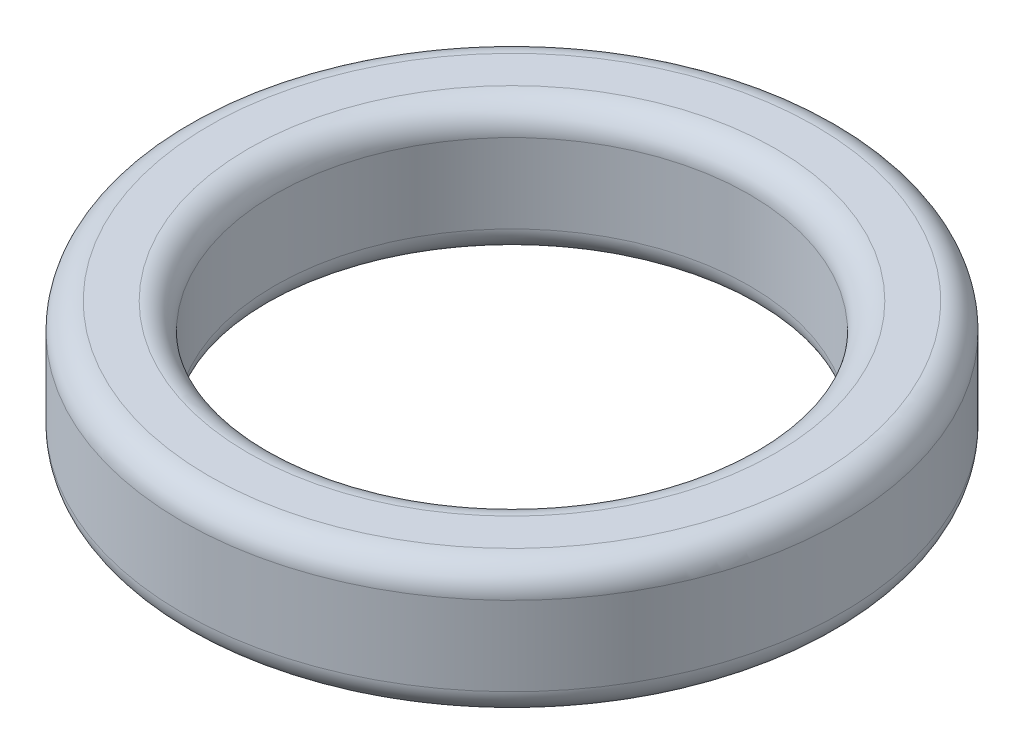
ISO-10303-21;
HEADER;
FILE_DESCRIPTION(('STEP AP214'),'2;1');
FILE_NAME('part.step','',(''),(''),'','','');
FILE_SCHEMA(('AUTOMOTIVE_DESIGN { 1 0 10303 214 1 1 1 1 }'));
ENDSEC;
DATA;
#1=APPLICATION_CONTEXT('core data for automotive mechanical design processes');
#2=APPLICATION_PROTOCOL_DEFINITION('international standard','automotive_design',2000,#1);
#3=PRODUCT_CONTEXT('',#1,'mechanical');
#4=PRODUCT('Part','Part','',(#3));
#5=PRODUCT_RELATED_PRODUCT_CATEGORY('part','',(#4));
#6=PRODUCT_DEFINITION_FORMATION('','',#4);
#7=PRODUCT_DEFINITION_CONTEXT('part definition',#1,'design');
#8=PRODUCT_DEFINITION('design','',#6,#7);
#9=PRODUCT_DEFINITION_SHAPE('','',#8);
#10=(LENGTH_UNIT() NAMED_UNIT(*) SI_UNIT(.MILLI.,.METRE.));
#11=(NAMED_UNIT(*) PLANE_ANGLE_UNIT() SI_UNIT($,.RADIAN.));
#12=(NAMED_UNIT(*) SI_UNIT($,.STERADIAN.) SOLID_ANGLE_UNIT());
#13=UNCERTAINTY_MEASURE_WITH_UNIT(LENGTH_MEASURE(1.E-05),#10,'distance_accuracy_value','');
#14=(GEOMETRIC_REPRESENTATION_CONTEXT(3) GLOBAL_UNCERTAINTY_ASSIGNED_CONTEXT((#13)) GLOBAL_UNIT_ASSIGNED_CONTEXT((#10,
#11,#12)) REPRESENTATION_CONTEXT('',''));
#15=CARTESIAN_POINT('',(0.,0.,0.));
#16=DIRECTION('',(0.,0.,1.));
#17=DIRECTION('',(1.,0.,0.));
#18=AXIS2_PLACEMENT_3D('',#15,#16,#17);
#19=CARTESIAN_POINT('',(0.,1.27,0.));
#20=DIRECTION('',(0.,1.,0.));
#21=DIRECTION('',(0.,0.,1.));
#22=AXIS2_PLACEMENT_3D('',#19,#20,#21);
#23=PLANE('',#22);
#24=CARTESIAN_POINT('',(0.,1.27,0.));
#25=DIRECTION('',(0.,1.,0.));
#26=DIRECTION('',(0.,0.,1.));
#27=AXIS2_PLACEMENT_3D('',#24,#25,#26);
#28=CIRCLE('',#27,2.54);
#29=CARTESIAN_POINT('',(0.,1.27,2.54));
#30=VERTEX_POINT('',#29);
#31=EDGE_CURVE('E10',#30,#30,#28,.F.);
#32=ORIENTED_EDGE('',*,*,#31,.T.);
#33=EDGE_LOOP('',(#32));
#34=FACE_BOUND('',#33,.T.);
#35=CARTESIAN_POINT('',(0.,1.27,0.));
#36=DIRECTION('',(0.,1.,0.));
#37=DIRECTION('',(0.,0.,1.));
#38=AXIS2_PLACEMENT_3D('',#35,#36,#37);
#39=CIRCLE('',#38,2.921);
#40=CARTESIAN_POINT('',(0.,1.27,2.921));
#41=VERTEX_POINT('',#40);
#42=EDGE_CURVE('E42',#41,#41,#39,.T.);
#43=ORIENTED_EDGE('',*,*,#42,.T.);
#44=EDGE_LOOP('',(#43));
#45=FACE_BOUND('',#44,.T.);
#46=ADVANCED_FACE('F35',(#34,#45),#23,.T.);
#47=CARTESIAN_POINT('',(0.,0.,0.));
#48=DIRECTION('',(0.,1.,0.));
#49=DIRECTION('',(0.,0.,1.));
#50=AXIS2_PLACEMENT_3D('',#47,#48,#49);
#51=PLANE('',#50);
#52=CARTESIAN_POINT('',(0.,0.,0.));
#53=DIRECTION('',(0.,1.,0.));
#54=DIRECTION('',(0.,0.,1.));
#55=AXIS2_PLACEMENT_3D('',#52,#53,#54);
#56=CIRCLE('',#55,2.54);
#57=CARTESIAN_POINT('',(0.,0.,2.54));
#58=VERTEX_POINT('',#57);
#59=EDGE_CURVE('E61',#58,#58,#56,.T.);
#60=ORIENTED_EDGE('',*,*,#59,.T.);
#61=EDGE_LOOP('',(#60));
#62=FACE_BOUND('',#61,.T.);
#63=CARTESIAN_POINT('',(0.,0.,0.));
#64=DIRECTION('',(0.,1.,0.));
#65=DIRECTION('',(0.,0.,1.));
#66=AXIS2_PLACEMENT_3D('',#63,#64,#65);
#67=CIRCLE('',#66,2.921);
#68=CARTESIAN_POINT('',(0.,0.,2.921));
#69=VERTEX_POINT('',#68);
#70=EDGE_CURVE('E64',#69,#69,#67,.F.);
#71=ORIENTED_EDGE('',*,*,#70,.T.);
#72=EDGE_LOOP('',(#71));
#73=FACE_BOUND('',#72,.T.);
#74=ADVANCED_FACE('F68',(#62,#73),#51,.F.);
#75=CARTESIAN_POINT('',(0.,1.27,0.));
#76=DIRECTION('',(0.,-1.,0.));
#77=DIRECTION('',(0.,0.,-1.));
#78=AXIS2_PLACEMENT_3D('',#75,#76,#77);
#79=CYLINDRICAL_SURFACE('',#78,3.175);
#80=CARTESIAN_POINT('',(0.,0.254,0.));
#81=DIRECTION('',(0.,1.,0.));
#82=DIRECTION('',(0.,0.,1.));
#83=AXIS2_PLACEMENT_3D('',#80,#81,#82);
#84=CIRCLE('',#83,3.175);
#85=CARTESIAN_POINT('',(0.,0.254,3.175));
#86=VERTEX_POINT('',#85);
#87=EDGE_CURVE('E46',#86,#86,#84,.T.);
#88=ORIENTED_EDGE('',*,*,#87,.T.);
#89=EDGE_LOOP('',(#88));
#90=FACE_BOUND('',#89,.T.);
#91=CARTESIAN_POINT('',(0.,1.016,0.));
#92=DIRECTION('',(0.,1.,0.));
#93=DIRECTION('',(0.,0.,1.));
#94=AXIS2_PLACEMENT_3D('',#91,#92,#93);
#95=CIRCLE('',#94,3.175);
#96=CARTESIAN_POINT('',(0.,1.016,3.175));
#97=VERTEX_POINT('',#96);
#98=EDGE_CURVE('E50',#97,#97,#95,.F.);
#99=ORIENTED_EDGE('',*,*,#98,.T.);
#100=EDGE_LOOP('',(#99));
#101=FACE_BOUND('',#100,.T.);
#102=ADVANCED_FACE('F78',(#90,#101),#79,.T.);
#103=CARTESIAN_POINT('',(0.,1.27,0.));
#104=DIRECTION('',(0.,-1.,0.));
#105=DIRECTION('',(0.,0.,-1.));
#106=AXIS2_PLACEMENT_3D('',#103,#104,#105);
#107=CYLINDRICAL_SURFACE('',#106,2.286);
#108=CARTESIAN_POINT('',(0.,0.254,0.));
#109=DIRECTION('',(0.,1.,0.));
#110=DIRECTION('',(0.,0.,1.));
#111=AXIS2_PLACEMENT_3D('',#108,#109,#110);
#112=CIRCLE('',#111,2.286);
#113=CARTESIAN_POINT('',(0.,0.254,2.286));
#114=VERTEX_POINT('',#113);
#115=EDGE_CURVE('E55',#114,#114,#112,.F.);
#116=ORIENTED_EDGE('',*,*,#115,.T.);
#117=EDGE_LOOP('',(#116));
#118=FACE_BOUND('',#117,.T.);
#119=CARTESIAN_POINT('',(0.,1.016,0.));
#120=DIRECTION('',(0.,1.,0.));
#121=DIRECTION('',(0.,0.,1.));
#122=AXIS2_PLACEMENT_3D('',#119,#120,#121);
#123=CIRCLE('',#122,2.286);
#124=CARTESIAN_POINT('',(0.,1.016,2.286));
#125=VERTEX_POINT('',#124);
#126=EDGE_CURVE('E58',#125,#125,#123,.T.);
#127=ORIENTED_EDGE('',*,*,#126,.T.);
#128=EDGE_LOOP('',(#127));
#129=FACE_BOUND('',#128,.T.);
#130=ADVANCED_FACE('F81',(#118,#129),#107,.F.);
#131=CARTESIAN_POINT('',(0.,0.254,0.));
#132=DIRECTION('',(0.,1.,0.));
#133=DIRECTION('',(0.,0.,1.));
#134=AXIS2_PLACEMENT_3D('',#131,#132,#133);
#135=TOROIDAL_SURFACE('',#134,2.54,0.254);
#136=ORIENTED_EDGE('',*,*,#115,.F.);
#137=EDGE_LOOP('',(#136));
#138=FACE_BOUND('',#137,.T.);
#139=ORIENTED_EDGE('',*,*,#59,.F.);
#140=EDGE_LOOP('',(#139));
#141=FACE_BOUND('',#140,.T.);
#142=ADVANCED_FACE('F74',(#138,#141),#135,.T.);
#143=CARTESIAN_POINT('',(0.,0.254,0.));
#144=DIRECTION('',(0.,1.,0.));
#145=DIRECTION('',(0.,0.,1.));
#146=AXIS2_PLACEMENT_3D('',#143,#144,#145);
#147=TOROIDAL_SURFACE('',#146,2.921,0.254);
#148=ORIENTED_EDGE('',*,*,#70,.F.);
#149=EDGE_LOOP('',(#148));
#150=FACE_BOUND('',#149,.T.);
#151=ORIENTED_EDGE('',*,*,#87,.F.);
#152=EDGE_LOOP('',(#151));
#153=FACE_BOUND('',#152,.T.);
#154=ADVANCED_FACE('F70',(#150,#153),#147,.T.);
#155=CARTESIAN_POINT('',(0.,1.016,0.));
#156=DIRECTION('',(0.,1.,0.));
#157=DIRECTION('',(0.,0.,1.));
#158=AXIS2_PLACEMENT_3D('',#155,#156,#157);
#159=TOROIDAL_SURFACE('',#158,2.54,0.254);
#160=ORIENTED_EDGE('',*,*,#31,.F.);
#161=EDGE_LOOP('',(#160));
#162=FACE_BOUND('',#161,.T.);
#163=ORIENTED_EDGE('',*,*,#126,.F.);
#164=EDGE_LOOP('',(#163));
#165=FACE_BOUND('',#164,.T.);
#166=ADVANCED_FACE('F73',(#162,#165),#159,.T.);
#167=CARTESIAN_POINT('',(0.,1.016,0.));
#168=DIRECTION('',(0.,1.,0.));
#169=DIRECTION('',(0.,0.,1.));
#170=AXIS2_PLACEMENT_3D('',#167,#168,#169);
#171=TOROIDAL_SURFACE('',#170,2.921,0.254);
#172=ORIENTED_EDGE('',*,*,#98,.F.);
#173=EDGE_LOOP('',(#172));
#174=FACE_BOUND('',#173,.T.);
#175=ORIENTED_EDGE('',*,*,#42,.F.);
#176=EDGE_LOOP('',(#175));
#177=FACE_BOUND('',#176,.T.);
#178=ADVANCED_FACE('F37',(#174,#177),#171,.T.);
#179=CLOSED_SHELL('',(#46,#74,#102,#130,#142,#154,#166,#178));
#180=MANIFOLD_SOLID_BREP('B2',#179);
#181=ADVANCED_BREP_SHAPE_REPRESENTATION('',(#18,#180),#14);
#182=SHAPE_DEFINITION_REPRESENTATION(#9,#181);
ENDSEC;
END-ISO-10303-21;
